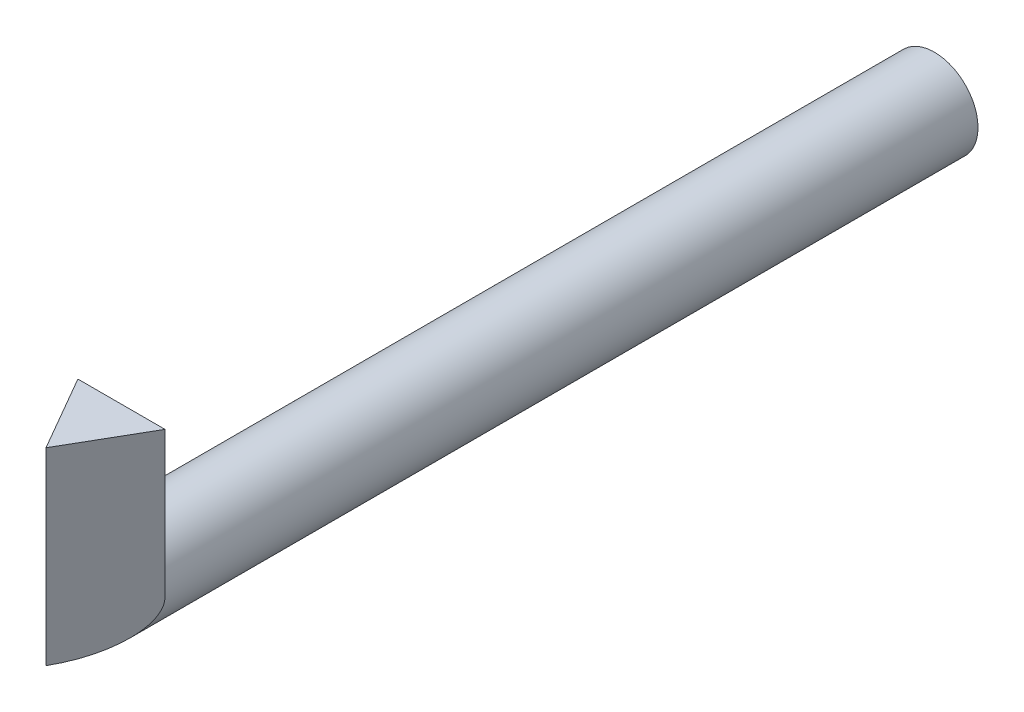
ISO-10303-21;
HEADER;
FILE_DESCRIPTION(('STEP AP214'),'2;1');
FILE_NAME('part.step','',(''),(''),'','','');
FILE_SCHEMA(('AUTOMOTIVE_DESIGN { 1 0 10303 214 1 1 1 1 }'));
ENDSEC;
DATA;
#1=APPLICATION_CONTEXT('core data for automotive mechanical design processes');
#2=APPLICATION_PROTOCOL_DEFINITION('international standard','automotive_design',2000,#1);
#3=PRODUCT_CONTEXT('',#1,'mechanical');
#4=PRODUCT('Part','Part','',(#3));
#5=PRODUCT_RELATED_PRODUCT_CATEGORY('part','',(#4));
#6=PRODUCT_DEFINITION_FORMATION('','',#4);
#7=PRODUCT_DEFINITION_CONTEXT('part definition',#1,'design');
#8=PRODUCT_DEFINITION('design','',#6,#7);
#9=PRODUCT_DEFINITION_SHAPE('','',#8);
#10=(LENGTH_UNIT() NAMED_UNIT(*) SI_UNIT(.MILLI.,.METRE.));
#11=(NAMED_UNIT(*) PLANE_ANGLE_UNIT() SI_UNIT($,.RADIAN.));
#12=(NAMED_UNIT(*) SI_UNIT($,.STERADIAN.) SOLID_ANGLE_UNIT());
#13=UNCERTAINTY_MEASURE_WITH_UNIT(LENGTH_MEASURE(1.E-05),#10,'distance_accuracy_value','');
#14=(GEOMETRIC_REPRESENTATION_CONTEXT(3) GLOBAL_UNCERTAINTY_ASSIGNED_CONTEXT((#13)) GLOBAL_UNIT_ASSIGNED_CONTEXT((#10,
#11,#12)) REPRESENTATION_CONTEXT('',''));
#15=CARTESIAN_POINT('',(0.,0.,0.));
#16=DIRECTION('',(0.,0.,1.));
#17=DIRECTION('',(1.,0.,0.));
#18=AXIS2_PLACEMENT_3D('',#15,#16,#17);
#19=CARTESIAN_POINT('',(0.,0.,31.));
#20=DIRECTION('',(0.,0.,-1.));
#21=DIRECTION('',(-1.,0.,0.));
#22=AXIS2_PLACEMENT_3D('',#19,#20,#21);
#23=CYLINDRICAL_SURFACE('',#22,1.5);
#24=CARTESIAN_POINT('',(0.,0.,30.5980762113533));
#25=DIRECTION('',(-0.866025403784439,0.,-0.5));
#26=DIRECTION('',(0.5,0.,-0.866025403784439));
#27=AXIS2_PLACEMENT_3D('',#24,#25,#26);
#28=ELLIPSE('',#27,3.,1.5);
#29=CARTESIAN_POINT('',(1.5,0.,28.));
#30=VERTEX_POINT('',#29);
#31=CARTESIAN_POINT('',(0.,-1.5,30.5980762113533));
#32=VERTEX_POINT('',#31);
#33=EDGE_CURVE('E81',#30,#32,#28,.T.);
#34=ORIENTED_EDGE('',*,*,#33,.T.);
#35=CARTESIAN_POINT('',(0.,0.,30.5980762113533));
#36=DIRECTION('',(0.866025403784439,0.,-0.499999999999999));
#37=DIRECTION('',(-0.499999999999999,0.,-0.866025403784439));
#38=AXIS2_PLACEMENT_3D('',#35,#36,#37);
#39=ELLIPSE('',#38,3.,1.5);
#40=CARTESIAN_POINT('',(-1.5,0.,28.));
#41=VERTEX_POINT('',#40);
#42=EDGE_CURVE('E53',#32,#41,#39,.T.);
#43=ORIENTED_EDGE('',*,*,#42,.T.);
#44=CARTESIAN_POINT('',(0.,0.,28.));
#45=DIRECTION('',(0.,0.,1.));
#46=DIRECTION('',(1.,0.,0.));
#47=AXIS2_PLACEMENT_3D('',#44,#45,#46);
#48=CIRCLE('',#47,1.5);
#49=EDGE_CURVE('E11',#30,#41,#48,.T.);
#50=ORIENTED_EDGE('',*,*,#49,.F.);
#51=EDGE_LOOP('',(#34,#43,#50));
#52=FACE_BOUND('',#51,.T.);
#53=CARTESIAN_POINT('',(0.,0.,0.));
#54=DIRECTION('',(0.,0.,1.));
#55=DIRECTION('',(1.,0.,0.));
#56=AXIS2_PLACEMENT_3D('',#53,#54,#55);
#57=CIRCLE('',#56,1.5);
#58=CARTESIAN_POINT('',(1.5,0.,0.));
#59=VERTEX_POINT('',#58);
#60=EDGE_CURVE('E46',#59,#59,#57,.T.);
#61=ORIENTED_EDGE('',*,*,#60,.T.);
#62=EDGE_LOOP('',(#61));
#63=FACE_BOUND('',#62,.T.);
#64=ADVANCED_FACE('F39',(#52,#63),#23,.T.);
#65=CARTESIAN_POINT('',(0.,0.,0.));
#66=DIRECTION('',(0.,0.,1.));
#67=DIRECTION('',(1.,0.,0.));
#68=AXIS2_PLACEMENT_3D('',#65,#66,#67);
#69=PLANE('',#68);
#70=ORIENTED_EDGE('',*,*,#60,.F.);
#71=EDGE_LOOP('',(#70));
#72=FACE_BOUND('',#71,.T.);
#73=ADVANCED_FACE('F100',(#72),#69,.F.);
#74=CARTESIAN_POINT('',(-1.5,-1.5,28.));
#75=DIRECTION('',(0.866025403784439,0.,-0.499999999999999));
#76=DIRECTION('',(-0.499999999999999,0.,-0.866025403784439));
#77=AXIS2_PLACEMENT_3D('',#74,#75,#76);
#78=PLANE('',#77);
#79=DIRECTION('',(0.,1.,0.));
#80=VECTOR('',#79,1.);
#81=CARTESIAN_POINT('',(0.,-1.5,30.5980762113533));
#82=LINE('',#81,#80);
#83=CARTESIAN_POINT('',(0.,5.,30.5980762113533));
#84=VERTEX_POINT('',#83);
#85=EDGE_CURVE('E74',#32,#84,#82,.T.);
#86=ORIENTED_EDGE('',*,*,#85,.T.);
#87=DIRECTION('',(0.5,0.,0.866025403784439));
#88=VECTOR('',#87,1.);
#89=CARTESIAN_POINT('',(-1.5,5.,28.));
#90=LINE('',#89,#88);
#91=CARTESIAN_POINT('',(-1.5,5.,28.));
#92=VERTEX_POINT('',#91);
#93=EDGE_CURVE('E77',#92,#84,#90,.T.);
#94=ORIENTED_EDGE('',*,*,#93,.F.);
#95=DIRECTION('',(0.,-1.,0.));
#96=VECTOR('',#95,1.);
#97=CARTESIAN_POINT('',(-1.5,5.,28.));
#98=LINE('',#97,#96);
#99=EDGE_CURVE('E92',#92,#41,#98,.T.);
#100=ORIENTED_EDGE('',*,*,#99,.T.);
#101=ORIENTED_EDGE('',*,*,#42,.F.);
#102=EDGE_LOOP('',(#86,#94,#100,#101));
#103=FACE_BOUND('',#102,.T.);
#104=ADVANCED_FACE('F76',(#103),#78,.F.);
#105=CARTESIAN_POINT('',(0.,-1.5,30.5980762113533));
#106=DIRECTION('',(-0.866025403784439,0.,-0.5));
#107=DIRECTION('',(-0.5,0.,0.866025403784439));
#108=AXIS2_PLACEMENT_3D('',#105,#106,#107);
#109=PLANE('',#108);
#110=ORIENTED_EDGE('',*,*,#33,.F.);
#111=DIRECTION('',(0.,-1.,0.));
#112=VECTOR('',#111,1.);
#113=CARTESIAN_POINT('',(1.5,5.,28.));
#114=LINE('',#113,#112);
#115=CARTESIAN_POINT('',(1.5,5.,28.));
#116=VERTEX_POINT('',#115);
#117=EDGE_CURVE('E82',#116,#30,#114,.T.);
#118=ORIENTED_EDGE('',*,*,#117,.F.);
#119=DIRECTION('',(0.499999999999999,0.,-0.866025403784439));
#120=VECTOR('',#119,1.);
#121=CARTESIAN_POINT('',(0.,5.,30.5980762113533));
#122=LINE('',#121,#120);
#123=EDGE_CURVE('E85',#84,#116,#122,.T.);
#124=ORIENTED_EDGE('',*,*,#123,.F.);
#125=ORIENTED_EDGE('',*,*,#85,.F.);
#126=EDGE_LOOP('',(#110,#118,#124,#125));
#127=FACE_BOUND('',#126,.T.);
#128=ADVANCED_FACE('F86',(#127),#109,.F.);
#129=CARTESIAN_POINT('',(1.5,5.,28.));
#130=DIRECTION('',(0.,0.,1.));
#131=DIRECTION('',(1.,0.,0.));
#132=AXIS2_PLACEMENT_3D('',#129,#130,#131);
#133=PLANE('',#132);
#134=ORIENTED_EDGE('',*,*,#117,.T.);
#135=ORIENTED_EDGE('',*,*,#49,.T.);
#136=ORIENTED_EDGE('',*,*,#99,.F.);
#137=DIRECTION('',(-1.,0.,0.));
#138=VECTOR('',#137,1.);
#139=CARTESIAN_POINT('',(1.5,5.,28.));
#140=LINE('',#139,#138);
#141=EDGE_CURVE('E62',#116,#92,#140,.T.);
#142=ORIENTED_EDGE('',*,*,#141,.F.);
#143=EDGE_LOOP('',(#134,#135,#136,#142));
#144=FACE_BOUND('',#143,.T.);
#145=ADVANCED_FACE('F110',(#144),#133,.F.);
#146=CARTESIAN_POINT('',(0.,5.,0.));
#147=DIRECTION('',(0.,1.,0.));
#148=DIRECTION('',(-1.,0.,0.));
#149=AXIS2_PLACEMENT_3D('',#146,#147,#148);
#150=PLANE('',#149);
#151=ORIENTED_EDGE('',*,*,#93,.T.);
#152=ORIENTED_EDGE('',*,*,#123,.T.);
#153=ORIENTED_EDGE('',*,*,#141,.T.);
#154=EDGE_LOOP('',(#151,#152,#153));
#155=FACE_BOUND('',#154,.T.);
#156=ADVANCED_FACE('F88',(#155),#150,.T.);
#157=CLOSED_SHELL('',(#64,#73,#104,#128,#145,#156));
#158=MANIFOLD_SOLID_BREP('B2',#157);
#159=ADVANCED_BREP_SHAPE_REPRESENTATION('',(#18,#158),#14);
#160=SHAPE_DEFINITION_REPRESENTATION(#9,#159);
ENDSEC;
END-ISO-10303-21;
